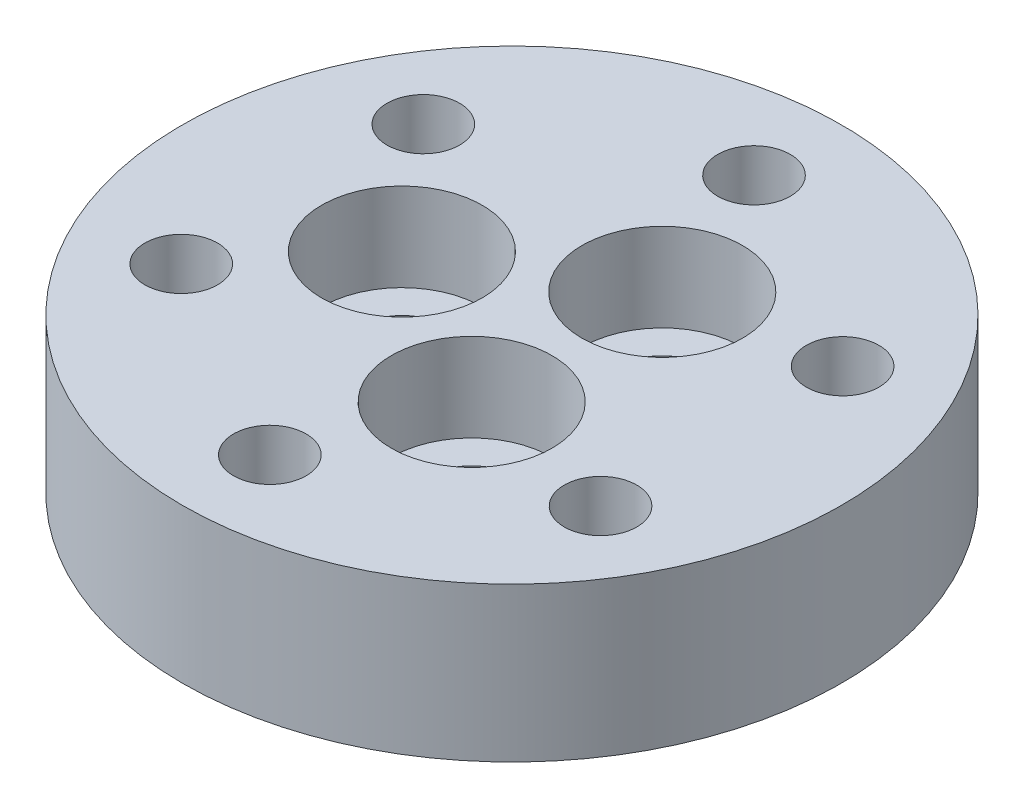
ISO-10303-21;
HEADER;
FILE_DESCRIPTION(('STEP AP214'),'2;1');
FILE_NAME('part.step','',(''),(''),'','','');
FILE_SCHEMA(('AUTOMOTIVE_DESIGN { 1 0 10303 214 1 1 1 1 }'));
ENDSEC;
DATA;
#1=APPLICATION_CONTEXT('core data for automotive mechanical design processes');
#2=APPLICATION_PROTOCOL_DEFINITION('international standard','automotive_design',2000,#1);
#3=PRODUCT_CONTEXT('',#1,'mechanical');
#4=PRODUCT('Part','Part','',(#3));
#5=PRODUCT_RELATED_PRODUCT_CATEGORY('part','',(#4));
#6=PRODUCT_DEFINITION_FORMATION('','',#4);
#7=PRODUCT_DEFINITION_CONTEXT('part definition',#1,'design');
#8=PRODUCT_DEFINITION('design','',#6,#7);
#9=PRODUCT_DEFINITION_SHAPE('','',#8);
#10=(LENGTH_UNIT() NAMED_UNIT(*) SI_UNIT(.MILLI.,.METRE.));
#11=(NAMED_UNIT(*) PLANE_ANGLE_UNIT() SI_UNIT($,.RADIAN.));
#12=(NAMED_UNIT(*) SI_UNIT($,.STERADIAN.) SOLID_ANGLE_UNIT());
#13=UNCERTAINTY_MEASURE_WITH_UNIT(LENGTH_MEASURE(1.E-05),#10,'distance_accuracy_value','');
#14=(GEOMETRIC_REPRESENTATION_CONTEXT(3) GLOBAL_UNCERTAINTY_ASSIGNED_CONTEXT((#13)) GLOBAL_UNIT_ASSIGNED_CONTEXT((#10,
#11,#12)) REPRESENTATION_CONTEXT('',''));
#15=CARTESIAN_POINT('',(0.,0.,0.));
#16=DIRECTION('',(0.,0.,1.));
#17=DIRECTION('',(1.,0.,0.));
#18=AXIS2_PLACEMENT_3D('',#15,#16,#17);
#19=CARTESIAN_POINT('',(2.5,-3.,4.33012701892219));
#20=DIRECTION('',(0.,1.,0.));
#21=DIRECTION('',(0.,0.,1.));
#22=AXIS2_PLACEMENT_3D('',#19,#20,#21);
#23=CYLINDRICAL_SURFACE('',#22,2.1);
#24=CARTESIAN_POINT('',(2.5,0.,4.33012701892219));
#25=DIRECTION('',(0.,1.,0.));
#26=DIRECTION('',(0.,0.,1.));
#27=AXIS2_PLACEMENT_3D('',#24,#25,#26);
#28=CIRCLE('',#27,2.1);
#29=CARTESIAN_POINT('',(2.5,0.,6.43012701892219));
#30=VERTEX_POINT('',#29);
#31=EDGE_CURVE('E58',#30,#30,#28,.T.);
#32=ORIENTED_EDGE('',*,*,#31,.F.);
#33=EDGE_LOOP('',(#32));
#34=FACE_BOUND('',#33,.T.);
#35=CARTESIAN_POINT('',(2.5,3.,4.33012701892219));
#36=DIRECTION('',(0.,1.,0.));
#37=DIRECTION('',(0.,0.,1.));
#38=AXIS2_PLACEMENT_3D('',#35,#36,#37);
#39=CIRCLE('',#38,2.1);
#40=CARTESIAN_POINT('',(2.5,3.,6.43012701892219));
#41=VERTEX_POINT('',#40);
#42=EDGE_CURVE('E43',#41,#41,#39,.F.);
#43=ORIENTED_EDGE('',*,*,#42,.F.);
#44=EDGE_LOOP('',(#43));
#45=FACE_BOUND('',#44,.T.);
#46=ADVANCED_FACE('F39',(#34,#45),#23,.F.);
#47=CARTESIAN_POINT('',(2.5,-3.,-4.33012701892219));
#48=DIRECTION('',(0.,1.,0.));
#49=DIRECTION('',(0.,0.,1.));
#50=AXIS2_PLACEMENT_3D('',#47,#48,#49);
#51=CYLINDRICAL_SURFACE('',#50,2.1);
#52=CARTESIAN_POINT('',(2.5,0.,-4.33012701892219));
#53=DIRECTION('',(0.,1.,0.));
#54=DIRECTION('',(0.,0.,1.));
#55=AXIS2_PLACEMENT_3D('',#52,#53,#54);
#56=CIRCLE('',#55,2.1);
#57=CARTESIAN_POINT('',(2.5,0.,-2.23012701892219));
#58=VERTEX_POINT('',#57);
#59=EDGE_CURVE('E61',#58,#58,#56,.T.);
#60=ORIENTED_EDGE('',*,*,#59,.F.);
#61=EDGE_LOOP('',(#60));
#62=FACE_BOUND('',#61,.T.);
#63=CARTESIAN_POINT('',(2.5,3.,-4.33012701892219));
#64=DIRECTION('',(0.,1.,0.));
#65=DIRECTION('',(0.,0.,1.));
#66=AXIS2_PLACEMENT_3D('',#63,#64,#65);
#67=CIRCLE('',#66,2.1);
#68=CARTESIAN_POINT('',(2.5,3.,-2.23012701892219));
#69=VERTEX_POINT('',#68);
#70=EDGE_CURVE('E87',#69,#69,#67,.F.);
#71=ORIENTED_EDGE('',*,*,#70,.F.);
#72=EDGE_LOOP('',(#71));
#73=FACE_BOUND('',#72,.T.);
#74=ADVANCED_FACE('F150',(#62,#73),#51,.F.);
#75=CARTESIAN_POINT('',(-5.,-3.,0.));
#76=DIRECTION('',(0.,1.,0.));
#77=DIRECTION('',(0.,0.,1.));
#78=AXIS2_PLACEMENT_3D('',#75,#76,#77);
#79=CYLINDRICAL_SURFACE('',#78,2.1);
#80=CARTESIAN_POINT('',(-5.,0.,0.));
#81=DIRECTION('',(0.,1.,0.));
#82=DIRECTION('',(0.,0.,1.));
#83=AXIS2_PLACEMENT_3D('',#80,#81,#82);
#84=CIRCLE('',#83,2.1);
#85=CARTESIAN_POINT('',(-5.,0.,2.1));
#86=VERTEX_POINT('',#85);
#87=EDGE_CURVE('E52',#86,#86,#84,.T.);
#88=ORIENTED_EDGE('',*,*,#87,.F.);
#89=EDGE_LOOP('',(#88));
#90=FACE_BOUND('',#89,.T.);
#91=CARTESIAN_POINT('',(-5.,3.,0.));
#92=DIRECTION('',(0.,1.,0.));
#93=DIRECTION('',(0.,0.,1.));
#94=AXIS2_PLACEMENT_3D('',#91,#92,#93);
#95=CIRCLE('',#94,2.1);
#96=CARTESIAN_POINT('',(-5.,3.,2.1));
#97=VERTEX_POINT('',#96);
#98=EDGE_CURVE('E85',#97,#97,#95,.F.);
#99=ORIENTED_EDGE('',*,*,#98,.F.);
#100=EDGE_LOOP('',(#99));
#101=FACE_BOUND('',#100,.T.);
#102=ADVANCED_FACE('F145',(#90,#101),#79,.F.);
#103=CARTESIAN_POINT('',(0.,7.,0.));
#104=DIRECTION('',(0.,-1.,0.));
#105=DIRECTION('',(0.,0.,-1.));
#106=AXIS2_PLACEMENT_3D('',#103,#104,#105);
#107=CYLINDRICAL_SURFACE('',#106,14.975);
#108=CARTESIAN_POINT('',(0.,7.,0.));
#109=DIRECTION('',(0.,1.,0.));
#110=DIRECTION('',(0.,0.,1.));
#111=AXIS2_PLACEMENT_3D('',#108,#109,#110);
#112=CIRCLE('',#111,14.975);
#113=CARTESIAN_POINT('',(0.,7.,14.975));
#114=VERTEX_POINT('',#113);
#115=EDGE_CURVE('E10',#114,#114,#112,.T.);
#116=ORIENTED_EDGE('',*,*,#115,.F.);
#117=EDGE_LOOP('',(#116));
#118=FACE_BOUND('',#117,.T.);
#119=CARTESIAN_POINT('',(0.,0.,0.));
#120=DIRECTION('',(0.,1.,0.));
#121=DIRECTION('',(0.,0.,1.));
#122=AXIS2_PLACEMENT_3D('',#119,#120,#121);
#123=CIRCLE('',#122,14.975);
#124=CARTESIAN_POINT('',(0.,0.,14.975));
#125=VERTEX_POINT('',#124);
#126=EDGE_CURVE('E47',#125,#125,#123,.T.);
#127=ORIENTED_EDGE('',*,*,#126,.T.);
#128=EDGE_LOOP('',(#127));
#129=FACE_BOUND('',#128,.T.);
#130=ADVANCED_FACE('F41',(#118,#129),#107,.T.);
#131=CARTESIAN_POINT('',(0.,7.,0.));
#132=DIRECTION('',(0.,1.,0.));
#133=DIRECTION('',(0.,0.,1.));
#134=AXIS2_PLACEMENT_3D('',#131,#132,#133);
#135=PLANE('',#134);
#136=CARTESIAN_POINT('',(-5.,7.,0.));
#137=DIRECTION('',(0.,1.,0.));
#138=DIRECTION('',(0.,0.,1.));
#139=AXIS2_PLACEMENT_3D('',#136,#137,#138);
#140=CIRCLE('',#139,3.65);
#141=CARTESIAN_POINT('',(-5.,7.,3.65));
#142=VERTEX_POINT('',#141);
#143=EDGE_CURVE('E209',#142,#142,#140,.T.);
#144=ORIENTED_EDGE('',*,*,#143,.F.);
#145=EDGE_LOOP('',(#144));
#146=FACE_BOUND('',#145,.T.);
#147=CARTESIAN_POINT('',(2.5,7.,-4.33012701892219));
#148=DIRECTION('',(0.,1.,0.));
#149=DIRECTION('',(0.,0.,1.));
#150=AXIS2_PLACEMENT_3D('',#147,#148,#149);
#151=CIRCLE('',#150,3.65);
#152=CARTESIAN_POINT('',(2.5,7.,-0.680127018922195));
#153=VERTEX_POINT('',#152);
#154=EDGE_CURVE('E212',#153,#153,#151,.T.);
#155=ORIENTED_EDGE('',*,*,#154,.F.);
#156=EDGE_LOOP('',(#155));
#157=FACE_BOUND('',#156,.T.);
#158=CARTESIAN_POINT('',(2.5,7.,4.33012701892219));
#159=DIRECTION('',(0.,1.,0.));
#160=DIRECTION('',(0.,0.,1.));
#161=AXIS2_PLACEMENT_3D('',#158,#159,#160);
#162=CIRCLE('',#161,3.65);
#163=CARTESIAN_POINT('',(2.5,7.,7.98012701892219));
#164=VERTEX_POINT('',#163);
#165=EDGE_CURVE('E220',#164,#164,#162,.T.);
#166=ORIENTED_EDGE('',*,*,#165,.F.);
#167=EDGE_LOOP('',(#166));
#168=FACE_BOUND('',#167,.T.);
#169=CARTESIAN_POINT('',(0.,7.,-11.));
#170=DIRECTION('',(0.,1.,0.));
#171=DIRECTION('',(0.,0.,1.));
#172=AXIS2_PLACEMENT_3D('',#169,#170,#171);
#173=CIRCLE('',#172,1.65);
#174=CARTESIAN_POINT('',(0.,7.,-9.35));
#175=VERTEX_POINT('',#174);
#176=EDGE_CURVE('E71',#175,#175,#173,.T.);
#177=ORIENTED_EDGE('',*,*,#176,.F.);
#178=EDGE_LOOP('',(#177));
#179=FACE_BOUND('',#178,.T.);
#180=CARTESIAN_POINT('',(-9.52627944162883,7.,-5.49999999999999));
#181=DIRECTION('',(0.,1.,0.));
#182=DIRECTION('',(0.,0.,1.));
#183=AXIS2_PLACEMENT_3D('',#180,#181,#182);
#184=CIRCLE('',#183,1.65);
#185=CARTESIAN_POINT('',(-9.52627944162883,7.,-3.84999999999999));
#186=VERTEX_POINT('',#185);
#187=EDGE_CURVE('E93',#186,#186,#184,.T.);
#188=ORIENTED_EDGE('',*,*,#187,.F.);
#189=EDGE_LOOP('',(#188));
#190=FACE_BOUND('',#189,.T.);
#191=CARTESIAN_POINT('',(-9.52627944162882,7.,5.50000000000001));
#192=DIRECTION('',(0.,1.,0.));
#193=DIRECTION('',(0.,0.,1.));
#194=AXIS2_PLACEMENT_3D('',#191,#192,#193);
#195=CIRCLE('',#194,1.65);
#196=CARTESIAN_POINT('',(-9.52627944162882,7.,7.15000000000001));
#197=VERTEX_POINT('',#196);
#198=EDGE_CURVE('E55',#197,#197,#195,.T.);
#199=ORIENTED_EDGE('',*,*,#198,.F.);
#200=EDGE_LOOP('',(#199));
#201=FACE_BOUND('',#200,.T.);
#202=CARTESIAN_POINT('',(0.,7.,11.));
#203=DIRECTION('',(0.,1.,0.));
#204=DIRECTION('',(0.,0.,1.));
#205=AXIS2_PLACEMENT_3D('',#202,#203,#204);
#206=CIRCLE('',#205,1.65);
#207=CARTESIAN_POINT('',(0.,7.,12.65));
#208=VERTEX_POINT('',#207);
#209=EDGE_CURVE('E101',#208,#208,#206,.T.);
#210=ORIENTED_EDGE('',*,*,#209,.F.);
#211=EDGE_LOOP('',(#210));
#212=FACE_BOUND('',#211,.T.);
#213=CARTESIAN_POINT('',(9.52627944162883,7.,5.5));
#214=DIRECTION('',(0.,1.,0.));
#215=DIRECTION('',(0.,0.,1.));
#216=AXIS2_PLACEMENT_3D('',#213,#214,#215);
#217=CIRCLE('',#216,1.65);
#218=CARTESIAN_POINT('',(9.52627944162883,7.,7.15));
#219=VERTEX_POINT('',#218);
#220=EDGE_CURVE('E108',#219,#219,#217,.T.);
#221=ORIENTED_EDGE('',*,*,#220,.F.);
#222=EDGE_LOOP('',(#221));
#223=FACE_BOUND('',#222,.T.);
#224=CARTESIAN_POINT('',(9.52627944162882,7.,-5.5));
#225=DIRECTION('',(0.,1.,0.));
#226=DIRECTION('',(0.,0.,1.));
#227=AXIS2_PLACEMENT_3D('',#224,#225,#226);
#228=CIRCLE('',#227,1.65);
#229=CARTESIAN_POINT('',(9.52627944162882,7.,-3.85));
#230=VERTEX_POINT('',#229);
#231=EDGE_CURVE('E105',#230,#230,#228,.T.);
#232=ORIENTED_EDGE('',*,*,#231,.F.);
#233=EDGE_LOOP('',(#232));
#234=FACE_BOUND('',#233,.T.);
#235=ORIENTED_EDGE('',*,*,#115,.T.);
#236=EDGE_LOOP('',(#235));
#237=FACE_BOUND('',#236,.T.);
#238=ADVANCED_FACE('F116',(#146,#157,#168,#179,#190,#201,#212,#223,#234,#237),#135,.T.);
#239=CARTESIAN_POINT('',(0.,0.,0.));
#240=DIRECTION('',(0.,1.,0.));
#241=DIRECTION('',(0.,0.,1.));
#242=AXIS2_PLACEMENT_3D('',#239,#240,#241);
#243=PLANE('',#242);
#244=CARTESIAN_POINT('',(0.,0.,-11.));
#245=DIRECTION('',(0.,1.,0.));
#246=DIRECTION('',(0.,0.,1.));
#247=AXIS2_PLACEMENT_3D('',#244,#245,#246);
#248=CIRCLE('',#247,1.65);
#249=CARTESIAN_POINT('',(0.,0.,-9.35));
#250=VERTEX_POINT('',#249);
#251=EDGE_CURVE('E62',#250,#250,#248,.T.);
#252=ORIENTED_EDGE('',*,*,#251,.T.);
#253=EDGE_LOOP('',(#252));
#254=FACE_BOUND('',#253,.T.);
#255=CARTESIAN_POINT('',(-9.52627944162883,0.,-5.49999999999999));
#256=DIRECTION('',(0.,1.,0.));
#257=DIRECTION('',(0.,0.,1.));
#258=AXIS2_PLACEMENT_3D('',#255,#256,#257);
#259=CIRCLE('',#258,1.65);
#260=CARTESIAN_POINT('',(-9.52627944162883,0.,-3.84999999999999));
#261=VERTEX_POINT('',#260);
#262=EDGE_CURVE('E80',#261,#261,#259,.T.);
#263=ORIENTED_EDGE('',*,*,#262,.T.);
#264=EDGE_LOOP('',(#263));
#265=FACE_BOUND('',#264,.T.);
#266=CARTESIAN_POINT('',(-9.52627944162882,0.,5.50000000000001));
#267=DIRECTION('',(0.,1.,0.));
#268=DIRECTION('',(0.,0.,1.));
#269=AXIS2_PLACEMENT_3D('',#266,#267,#268);
#270=CIRCLE('',#269,1.65);
#271=CARTESIAN_POINT('',(-9.52627944162882,0.,7.15000000000001));
#272=VERTEX_POINT('',#271);
#273=EDGE_CURVE('E77',#272,#272,#270,.T.);
#274=ORIENTED_EDGE('',*,*,#273,.T.);
#275=EDGE_LOOP('',(#274));
#276=FACE_BOUND('',#275,.T.);
#277=CARTESIAN_POINT('',(0.,0.,11.));
#278=DIRECTION('',(0.,1.,0.));
#279=DIRECTION('',(0.,0.,1.));
#280=AXIS2_PLACEMENT_3D('',#277,#278,#279);
#281=CIRCLE('',#280,1.65);
#282=CARTESIAN_POINT('',(0.,0.,12.65));
#283=VERTEX_POINT('',#282);
#284=EDGE_CURVE('E74',#283,#283,#281,.T.);
#285=ORIENTED_EDGE('',*,*,#284,.T.);
#286=EDGE_LOOP('',(#285));
#287=FACE_BOUND('',#286,.T.);
#288=CARTESIAN_POINT('',(9.52627944162883,0.,5.5));
#289=DIRECTION('',(0.,1.,0.));
#290=DIRECTION('',(0.,0.,1.));
#291=AXIS2_PLACEMENT_3D('',#288,#289,#290);
#292=CIRCLE('',#291,1.65);
#293=CARTESIAN_POINT('',(9.52627944162883,0.,7.15));
#294=VERTEX_POINT('',#293);
#295=EDGE_CURVE('E70',#294,#294,#292,.T.);
#296=ORIENTED_EDGE('',*,*,#295,.T.);
#297=EDGE_LOOP('',(#296));
#298=FACE_BOUND('',#297,.T.);
#299=CARTESIAN_POINT('',(9.52627944162882,0.,-5.5));
#300=DIRECTION('',(0.,1.,0.));
#301=DIRECTION('',(0.,0.,1.));
#302=AXIS2_PLACEMENT_3D('',#299,#300,#301);
#303=CIRCLE('',#302,1.65);
#304=CARTESIAN_POINT('',(9.52627944162882,0.,-3.85));
#305=VERTEX_POINT('',#304);
#306=EDGE_CURVE('E67',#305,#305,#303,.T.);
#307=ORIENTED_EDGE('',*,*,#306,.T.);
#308=EDGE_LOOP('',(#307));
#309=FACE_BOUND('',#308,.T.);
#310=ORIENTED_EDGE('',*,*,#87,.T.);
#311=EDGE_LOOP('',(#310));
#312=FACE_BOUND('',#311,.T.);
#313=ORIENTED_EDGE('',*,*,#59,.T.);
#314=EDGE_LOOP('',(#313));
#315=FACE_BOUND('',#314,.T.);
#316=ORIENTED_EDGE('',*,*,#31,.T.);
#317=EDGE_LOOP('',(#316));
#318=FACE_BOUND('',#317,.T.);
#319=ORIENTED_EDGE('',*,*,#126,.F.);
#320=EDGE_LOOP('',(#319));
#321=FACE_BOUND('',#320,.T.);
#322=ADVANCED_FACE('F119',(#254,#265,#276,#287,#298,#309,#312,#315,#318,#321),#243,.F.);
#323=CARTESIAN_POINT('',(9.52627944162882,-3.,-5.5));
#324=DIRECTION('',(0.,1.,0.));
#325=DIRECTION('',(0.,0.,1.));
#326=AXIS2_PLACEMENT_3D('',#323,#324,#325);
#327=CYLINDRICAL_SURFACE('',#326,1.65);
#328=ORIENTED_EDGE('',*,*,#231,.T.);
#329=EDGE_LOOP('',(#328));
#330=FACE_BOUND('',#329,.T.);
#331=ORIENTED_EDGE('',*,*,#306,.F.);
#332=EDGE_LOOP('',(#331));
#333=FACE_BOUND('',#332,.T.);
#334=ADVANCED_FACE('F126',(#330,#333),#327,.F.);
#335=CARTESIAN_POINT('',(9.52627944162883,-3.,5.5));
#336=DIRECTION('',(0.,1.,0.));
#337=DIRECTION('',(0.,0.,1.));
#338=AXIS2_PLACEMENT_3D('',#335,#336,#337);
#339=CYLINDRICAL_SURFACE('',#338,1.65);
#340=ORIENTED_EDGE('',*,*,#220,.T.);
#341=EDGE_LOOP('',(#340));
#342=FACE_BOUND('',#341,.T.);
#343=ORIENTED_EDGE('',*,*,#295,.F.);
#344=EDGE_LOOP('',(#343));
#345=FACE_BOUND('',#344,.T.);
#346=ADVANCED_FACE('F129',(#342,#345),#339,.F.);
#347=CARTESIAN_POINT('',(0.,-3.,11.));
#348=DIRECTION('',(0.,1.,0.));
#349=DIRECTION('',(0.,0.,1.));
#350=AXIS2_PLACEMENT_3D('',#347,#348,#349);
#351=CYLINDRICAL_SURFACE('',#350,1.65);
#352=ORIENTED_EDGE('',*,*,#209,.T.);
#353=EDGE_LOOP('',(#352));
#354=FACE_BOUND('',#353,.T.);
#355=ORIENTED_EDGE('',*,*,#284,.F.);
#356=EDGE_LOOP('',(#355));
#357=FACE_BOUND('',#356,.T.);
#358=ADVANCED_FACE('F113',(#354,#357),#351,.F.);
#359=CARTESIAN_POINT('',(-9.52627944162882,-3.,5.50000000000001));
#360=DIRECTION('',(0.,1.,0.));
#361=DIRECTION('',(0.,0.,1.));
#362=AXIS2_PLACEMENT_3D('',#359,#360,#361);
#363=CYLINDRICAL_SURFACE('',#362,1.65);
#364=ORIENTED_EDGE('',*,*,#198,.T.);
#365=EDGE_LOOP('',(#364));
#366=FACE_BOUND('',#365,.T.);
#367=ORIENTED_EDGE('',*,*,#273,.F.);
#368=EDGE_LOOP('',(#367));
#369=FACE_BOUND('',#368,.T.);
#370=ADVANCED_FACE('F163',(#366,#369),#363,.F.);
#371=CARTESIAN_POINT('',(-9.52627944162883,-3.,-5.49999999999999));
#372=DIRECTION('',(0.,1.,0.));
#373=DIRECTION('',(0.,0.,1.));
#374=AXIS2_PLACEMENT_3D('',#371,#372,#373);
#375=CYLINDRICAL_SURFACE('',#374,1.65);
#376=ORIENTED_EDGE('',*,*,#187,.T.);
#377=EDGE_LOOP('',(#376));
#378=FACE_BOUND('',#377,.T.);
#379=ORIENTED_EDGE('',*,*,#262,.F.);
#380=EDGE_LOOP('',(#379));
#381=FACE_BOUND('',#380,.T.);
#382=ADVANCED_FACE('F166',(#378,#381),#375,.F.);
#383=CARTESIAN_POINT('',(0.,-3.,-11.));
#384=DIRECTION('',(0.,1.,0.));
#385=DIRECTION('',(0.,0.,1.));
#386=AXIS2_PLACEMENT_3D('',#383,#384,#385);
#387=CYLINDRICAL_SURFACE('',#386,1.65);
#388=ORIENTED_EDGE('',*,*,#176,.T.);
#389=EDGE_LOOP('',(#388));
#390=FACE_BOUND('',#389,.T.);
#391=ORIENTED_EDGE('',*,*,#251,.F.);
#392=EDGE_LOOP('',(#391));
#393=FACE_BOUND('',#392,.T.);
#394=ADVANCED_FACE('F175',(#390,#393),#387,.F.);
#395=CARTESIAN_POINT('',(-5.,3.,0.));
#396=DIRECTION('',(0.,1.,0.));
#397=DIRECTION('',(0.,0.,1.));
#398=AXIS2_PLACEMENT_3D('',#395,#396,#397);
#399=PLANE('',#398);
#400=CARTESIAN_POINT('',(-5.,3.,0.));
#401=DIRECTION('',(0.,1.,0.));
#402=DIRECTION('',(0.,0.,1.));
#403=AXIS2_PLACEMENT_3D('',#400,#401,#402);
#404=CIRCLE('',#403,3.65);
#405=CARTESIAN_POINT('',(-5.,3.,3.65));
#406=VERTEX_POINT('',#405);
#407=EDGE_CURVE('E88',#406,#406,#404,.T.);
#408=ORIENTED_EDGE('',*,*,#407,.T.);
#409=EDGE_LOOP('',(#408));
#410=FACE_BOUND('',#409,.T.);
#411=ORIENTED_EDGE('',*,*,#98,.T.);
#412=EDGE_LOOP('',(#411));
#413=FACE_BOUND('',#412,.T.);
#414=ADVANCED_FACE('F178',(#410,#413),#399,.T.);
#415=CARTESIAN_POINT('',(-5.,3.,0.));
#416=DIRECTION('',(0.,1.,0.));
#417=DIRECTION('',(0.,0.,1.));
#418=AXIS2_PLACEMENT_3D('',#415,#416,#417);
#419=CYLINDRICAL_SURFACE('',#418,3.65);
#420=ORIENTED_EDGE('',*,*,#407,.F.);
#421=EDGE_LOOP('',(#420));
#422=FACE_BOUND('',#421,.T.);
#423=ORIENTED_EDGE('',*,*,#143,.T.);
#424=EDGE_LOOP('',(#423));
#425=FACE_BOUND('',#424,.T.);
#426=ADVANCED_FACE('F192',(#422,#425),#419,.F.);
#427=CARTESIAN_POINT('',(2.5,3.,-4.33012701892219));
#428=DIRECTION('',(0.,1.,0.));
#429=DIRECTION('',(0.,0.,1.));
#430=AXIS2_PLACEMENT_3D('',#427,#428,#429);
#431=PLANE('',#430);
#432=CARTESIAN_POINT('',(2.5,3.,-4.33012701892219));
#433=DIRECTION('',(0.,1.,0.));
#434=DIRECTION('',(0.,0.,1.));
#435=AXIS2_PLACEMENT_3D('',#432,#433,#434);
#436=CIRCLE('',#435,3.65);
#437=CARTESIAN_POINT('',(2.5,3.,-0.680127018922195));
#438=VERTEX_POINT('',#437);
#439=EDGE_CURVE('E217',#438,#438,#436,.T.);
#440=ORIENTED_EDGE('',*,*,#439,.T.);
#441=EDGE_LOOP('',(#440));
#442=FACE_BOUND('',#441,.T.);
#443=ORIENTED_EDGE('',*,*,#70,.T.);
#444=EDGE_LOOP('',(#443));
#445=FACE_BOUND('',#444,.T.);
#446=ADVANCED_FACE('F189',(#442,#445),#431,.T.);
#447=CARTESIAN_POINT('',(2.5,3.,-4.33012701892219));
#448=DIRECTION('',(0.,1.,0.));
#449=DIRECTION('',(0.,0.,1.));
#450=AXIS2_PLACEMENT_3D('',#447,#448,#449);
#451=CYLINDRICAL_SURFACE('',#450,3.65);
#452=ORIENTED_EDGE('',*,*,#439,.F.);
#453=EDGE_LOOP('',(#452));
#454=FACE_BOUND('',#453,.T.);
#455=ORIENTED_EDGE('',*,*,#154,.T.);
#456=EDGE_LOOP('',(#455));
#457=FACE_BOUND('',#456,.T.);
#458=ADVANCED_FACE('F184',(#454,#457),#451,.F.);
#459=CARTESIAN_POINT('',(2.5,3.,4.33012701892219));
#460=DIRECTION('',(0.,1.,0.));
#461=DIRECTION('',(0.,0.,1.));
#462=AXIS2_PLACEMENT_3D('',#459,#460,#461);
#463=PLANE('',#462);
#464=CARTESIAN_POINT('',(2.5,3.,4.33012701892219));
#465=DIRECTION('',(0.,1.,0.));
#466=DIRECTION('',(0.,0.,1.));
#467=AXIS2_PLACEMENT_3D('',#464,#465,#466);
#468=CIRCLE('',#467,3.65);
#469=CARTESIAN_POINT('',(2.5,3.,7.98012701892219));
#470=VERTEX_POINT('',#469);
#471=EDGE_CURVE('E222',#470,#470,#468,.T.);
#472=ORIENTED_EDGE('',*,*,#471,.T.);
#473=EDGE_LOOP('',(#472));
#474=FACE_BOUND('',#473,.T.);
#475=ORIENTED_EDGE('',*,*,#42,.T.);
#476=EDGE_LOOP('',(#475));
#477=FACE_BOUND('',#476,.T.);
#478=ADVANCED_FACE('F180',(#474,#477),#463,.T.);
#479=CARTESIAN_POINT('',(2.5,3.,4.33012701892219));
#480=DIRECTION('',(0.,1.,0.));
#481=DIRECTION('',(0.,0.,1.));
#482=AXIS2_PLACEMENT_3D('',#479,#480,#481);
#483=CYLINDRICAL_SURFACE('',#482,3.65);
#484=ORIENTED_EDGE('',*,*,#471,.F.);
#485=EDGE_LOOP('',(#484));
#486=FACE_BOUND('',#485,.T.);
#487=ORIENTED_EDGE('',*,*,#165,.T.);
#488=EDGE_LOOP('',(#487));
#489=FACE_BOUND('',#488,.T.);
#490=ADVANCED_FACE('F183',(#486,#489),#483,.F.);
#491=CLOSED_SHELL('',(#46,#74,#102,#130,#238,#322,#334,#346,#358,#370,#382,#394,#414,#426,#446,
#458,#478,#490));
#492=MANIFOLD_SOLID_BREP('B2',#491);
#493=ADVANCED_BREP_SHAPE_REPRESENTATION('',(#18,#492),#14);
#494=SHAPE_DEFINITION_REPRESENTATION(#9,#493);
ENDSEC;
END-ISO-10303-21;
